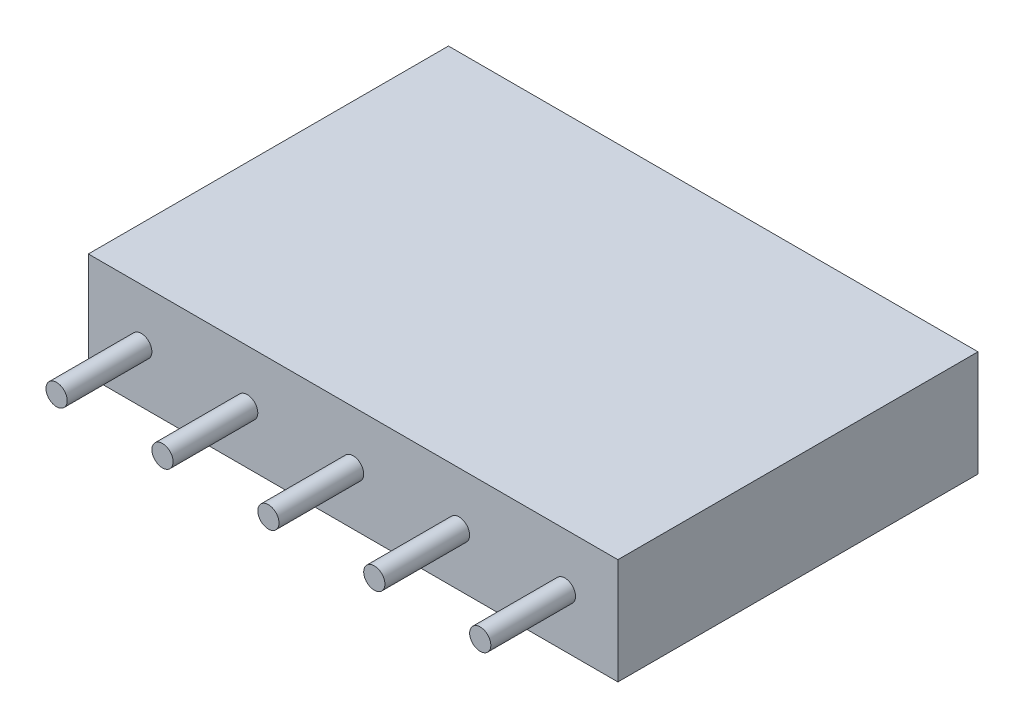
ISO-10303-21;
HEADER;
FILE_DESCRIPTION(('STEP AP214'),'2;1');
FILE_NAME('part.step','',(''),(''),'','','');
FILE_SCHEMA(('AUTOMOTIVE_DESIGN { 1 0 10303 214 1 1 1 1 }'));
ENDSEC;
DATA;
#1=APPLICATION_CONTEXT('core data for automotive mechanical design processes');
#2=APPLICATION_PROTOCOL_DEFINITION('international standard','automotive_design',2000,#1);
#3=PRODUCT_CONTEXT('',#1,'mechanical');
#4=PRODUCT('Part','Part','',(#3));
#5=PRODUCT_RELATED_PRODUCT_CATEGORY('part','',(#4));
#6=PRODUCT_DEFINITION_FORMATION('','',#4);
#7=PRODUCT_DEFINITION_CONTEXT('part definition',#1,'design');
#8=PRODUCT_DEFINITION('design','',#6,#7);
#9=PRODUCT_DEFINITION_SHAPE('','',#8);
#10=(LENGTH_UNIT() NAMED_UNIT(*) SI_UNIT(.MILLI.,.METRE.));
#11=(NAMED_UNIT(*) PLANE_ANGLE_UNIT() SI_UNIT($,.RADIAN.));
#12=(NAMED_UNIT(*) SI_UNIT($,.STERADIAN.) SOLID_ANGLE_UNIT());
#13=UNCERTAINTY_MEASURE_WITH_UNIT(LENGTH_MEASURE(1.E-05),#10,'distance_accuracy_value','');
#14=(GEOMETRIC_REPRESENTATION_CONTEXT(3) GLOBAL_UNCERTAINTY_ASSIGNED_CONTEXT((#13)) GLOBAL_UNIT_ASSIGNED_CONTEXT((#10,
#11,#12)) REPRESENTATION_CONTEXT('',''));
#15=CARTESIAN_POINT('',(0.,0.,0.));
#16=DIRECTION('',(0.,0.,1.));
#17=DIRECTION('',(1.,0.,0.));
#18=AXIS2_PLACEMENT_3D('',#15,#16,#17);
#19=CARTESIAN_POINT('',(-11.25,1.25,10.5));
#20=DIRECTION('',(0.,0.,1.));
#21=DIRECTION('',(1.,0.,0.));
#22=AXIS2_PLACEMENT_3D('',#19,#20,#21);
#23=PLANE('',#22);
#24=CARTESIAN_POINT('',(-11.25,1.25,10.5));
#25=DIRECTION('',(0.,0.,1.));
#26=DIRECTION('',(1.,0.,0.));
#27=AXIS2_PLACEMENT_3D('',#24,#25,#26);
#28=CIRCLE('',#27,0.25);
#29=CARTESIAN_POINT('',(-11.,1.25,10.5));
#30=VERTEX_POINT('',#29);
#31=EDGE_CURVE('E11',#30,#30,#28,.T.);
#32=ORIENTED_EDGE('',*,*,#31,.T.);
#33=EDGE_LOOP('',(#32));
#34=FACE_BOUND('',#33,.T.);
#35=ADVANCED_FACE('F33',(#34),#23,.T.);
#36=CARTESIAN_POINT('',(-11.25,1.25,10.5));
#37=DIRECTION('',(0.,0.,-1.));
#38=DIRECTION('',(-1.,0.,0.));
#39=AXIS2_PLACEMENT_3D('',#36,#37,#38);
#40=CYLINDRICAL_SURFACE('',#39,0.25);
#41=ORIENTED_EDGE('',*,*,#31,.F.);
#42=EDGE_LOOP('',(#41));
#43=FACE_BOUND('',#42,.T.);
#44=CARTESIAN_POINT('',(-11.25,1.25,8.5));
#45=DIRECTION('',(0.,0.,1.));
#46=DIRECTION('',(1.,0.,0.));
#47=AXIS2_PLACEMENT_3D('',#44,#45,#46);
#48=CIRCLE('',#47,0.25);
#49=CARTESIAN_POINT('',(-11.,1.25,8.5));
#50=VERTEX_POINT('',#49);
#51=EDGE_CURVE('E41',#50,#50,#48,.T.);
#52=ORIENTED_EDGE('',*,*,#51,.T.);
#53=EDGE_LOOP('',(#52));
#54=FACE_BOUND('',#53,.T.);
#55=ADVANCED_FACE('F135',(#43,#54),#40,.T.);
#56=CARTESIAN_POINT('',(-8.75,1.25,10.5));
#57=DIRECTION('',(0.,0.,1.));
#58=DIRECTION('',(1.,0.,0.));
#59=AXIS2_PLACEMENT_3D('',#56,#57,#58);
#60=PLANE('',#59);
#61=CARTESIAN_POINT('',(-8.75,1.25,10.5));
#62=DIRECTION('',(0.,0.,1.));
#63=DIRECTION('',(1.,0.,0.));
#64=AXIS2_PLACEMENT_3D('',#61,#62,#63);
#65=CIRCLE('',#64,0.25);
#66=CARTESIAN_POINT('',(-8.5,1.25,10.5));
#67=VERTEX_POINT('',#66);
#68=EDGE_CURVE('E130',#67,#67,#65,.T.);
#69=ORIENTED_EDGE('',*,*,#68,.T.);
#70=EDGE_LOOP('',(#69));
#71=FACE_BOUND('',#70,.T.);
#72=ADVANCED_FACE('F158',(#71),#60,.T.);
#73=CARTESIAN_POINT('',(-8.75,1.25,10.5));
#74=DIRECTION('',(0.,0.,-1.));
#75=DIRECTION('',(-1.,0.,0.));
#76=AXIS2_PLACEMENT_3D('',#73,#74,#75);
#77=CYLINDRICAL_SURFACE('',#76,0.25);
#78=ORIENTED_EDGE('',*,*,#68,.F.);
#79=EDGE_LOOP('',(#78));
#80=FACE_BOUND('',#79,.T.);
#81=CARTESIAN_POINT('',(-8.75,1.25,8.5));
#82=DIRECTION('',(0.,0.,1.));
#83=DIRECTION('',(1.,0.,0.));
#84=AXIS2_PLACEMENT_3D('',#81,#82,#83);
#85=CIRCLE('',#84,0.25);
#86=CARTESIAN_POINT('',(-8.5,1.25,8.5));
#87=VERTEX_POINT('',#86);
#88=EDGE_CURVE('E127',#87,#87,#85,.T.);
#89=ORIENTED_EDGE('',*,*,#88,.T.);
#90=EDGE_LOOP('',(#89));
#91=FACE_BOUND('',#90,.T.);
#92=ADVANCED_FACE('F164',(#80,#91),#77,.T.);
#93=CARTESIAN_POINT('',(-6.25,1.25,10.5));
#94=DIRECTION('',(0.,0.,1.));
#95=DIRECTION('',(1.,0.,0.));
#96=AXIS2_PLACEMENT_3D('',#93,#94,#95);
#97=PLANE('',#96);
#98=CARTESIAN_POINT('',(-6.25,1.25,10.5));
#99=DIRECTION('',(0.,0.,1.));
#100=DIRECTION('',(1.,0.,0.));
#101=AXIS2_PLACEMENT_3D('',#98,#99,#100);
#102=CIRCLE('',#101,0.25);
#103=CARTESIAN_POINT('',(-6.,1.25,10.5));
#104=VERTEX_POINT('',#103);
#105=EDGE_CURVE('E124',#104,#104,#102,.T.);
#106=ORIENTED_EDGE('',*,*,#105,.T.);
#107=EDGE_LOOP('',(#106));
#108=FACE_BOUND('',#107,.T.);
#109=ADVANCED_FACE('F170',(#108),#97,.T.);
#110=CARTESIAN_POINT('',(-6.25,1.25,10.5));
#111=DIRECTION('',(0.,0.,-1.));
#112=DIRECTION('',(-1.,0.,0.));
#113=AXIS2_PLACEMENT_3D('',#110,#111,#112);
#114=CYLINDRICAL_SURFACE('',#113,0.25);
#115=ORIENTED_EDGE('',*,*,#105,.F.);
#116=EDGE_LOOP('',(#115));
#117=FACE_BOUND('',#116,.T.);
#118=CARTESIAN_POINT('',(-6.25,1.25,8.5));
#119=DIRECTION('',(0.,0.,1.));
#120=DIRECTION('',(1.,0.,0.));
#121=AXIS2_PLACEMENT_3D('',#118,#119,#120);
#122=CIRCLE('',#121,0.25);
#123=CARTESIAN_POINT('',(-6.,1.25,8.5));
#124=VERTEX_POINT('',#123);
#125=EDGE_CURVE('E121',#124,#124,#122,.T.);
#126=ORIENTED_EDGE('',*,*,#125,.T.);
#127=EDGE_LOOP('',(#126));
#128=FACE_BOUND('',#127,.T.);
#129=ADVANCED_FACE('F174',(#117,#128),#114,.T.);
#130=CARTESIAN_POINT('',(0.,0.,8.5));
#131=DIRECTION('',(-1.,0.,0.));
#132=DIRECTION('',(0.,0.,1.));
#133=AXIS2_PLACEMENT_3D('',#130,#131,#132);
#134=PLANE('',#133);
#135=DIRECTION('',(0.,1.,0.));
#136=VECTOR('',#135,1.);
#137=CARTESIAN_POINT('',(0.,0.,0.));
#138=LINE('',#137,#136);
#139=CARTESIAN_POINT('',(0.,0.,0.));
#140=VERTEX_POINT('',#139);
#141=CARTESIAN_POINT('',(0.,2.5,0.));
#142=VERTEX_POINT('',#141);
#143=EDGE_CURVE('E79',#140,#142,#138,.T.);
#144=ORIENTED_EDGE('',*,*,#143,.T.);
#145=DIRECTION('',(0.,0.,-1.));
#146=VECTOR('',#145,1.);
#147=CARTESIAN_POINT('',(0.,2.5,8.5));
#148=LINE('',#147,#146);
#149=CARTESIAN_POINT('',(0.,2.5,8.5));
#150=VERTEX_POINT('',#149);
#151=EDGE_CURVE('E119',#150,#142,#148,.T.);
#152=ORIENTED_EDGE('',*,*,#151,.F.);
#153=DIRECTION('',(0.,1.,0.));
#154=VECTOR('',#153,1.);
#155=CARTESIAN_POINT('',(0.,0.,8.5));
#156=LINE('',#155,#154);
#157=CARTESIAN_POINT('',(0.,0.,8.5));
#158=VERTEX_POINT('',#157);
#159=EDGE_CURVE('E81',#158,#150,#156,.T.);
#160=ORIENTED_EDGE('',*,*,#159,.F.);
#161=DIRECTION('',(0.,0.,-1.));
#162=VECTOR('',#161,1.);
#163=CARTESIAN_POINT('',(0.,0.,8.5));
#164=LINE('',#163,#162);
#165=EDGE_CURVE('E115',#158,#140,#164,.T.);
#166=ORIENTED_EDGE('',*,*,#165,.T.);
#167=EDGE_LOOP('',(#144,#152,#160,#166));
#168=FACE_BOUND('',#167,.T.);
#169=ADVANCED_FACE('F178',(#168),#134,.F.);
#170=CARTESIAN_POINT('',(0.,2.5,8.5));
#171=DIRECTION('',(0.,-1.,0.));
#172=DIRECTION('',(1.,0.,0.));
#173=AXIS2_PLACEMENT_3D('',#170,#171,#172);
#174=PLANE('',#173);
#175=DIRECTION('',(-1.,0.,0.));
#176=VECTOR('',#175,1.);
#177=CARTESIAN_POINT('',(0.,2.5,0.));
#178=LINE('',#177,#176);
#179=CARTESIAN_POINT('',(-12.5,2.5,0.));
#180=VERTEX_POINT('',#179);
#181=EDGE_CURVE('E61',#142,#180,#178,.T.);
#182=ORIENTED_EDGE('',*,*,#181,.T.);
#183=DIRECTION('',(0.,0.,-1.));
#184=VECTOR('',#183,1.);
#185=CARTESIAN_POINT('',(-12.5,2.5,8.5));
#186=LINE('',#185,#184);
#187=CARTESIAN_POINT('',(-12.5,2.5,8.5));
#188=VERTEX_POINT('',#187);
#189=EDGE_CURVE('E90',#188,#180,#186,.T.);
#190=ORIENTED_EDGE('',*,*,#189,.F.);
#191=DIRECTION('',(-1.,0.,0.));
#192=VECTOR('',#191,1.);
#193=CARTESIAN_POINT('',(0.,2.5,8.5));
#194=LINE('',#193,#192);
#195=EDGE_CURVE('E112',#150,#188,#194,.T.);
#196=ORIENTED_EDGE('',*,*,#195,.F.);
#197=ORIENTED_EDGE('',*,*,#151,.T.);
#198=EDGE_LOOP('',(#182,#190,#196,#197));
#199=FACE_BOUND('',#198,.T.);
#200=ADVANCED_FACE('F148',(#199),#174,.F.);
#201=CARTESIAN_POINT('',(0.,0.,8.5));
#202=DIRECTION('',(0.,1.,0.));
#203=DIRECTION('',(0.,0.,1.));
#204=AXIS2_PLACEMENT_3D('',#201,#202,#203);
#205=PLANE('',#204);
#206=DIRECTION('',(1.,0.,0.));
#207=VECTOR('',#206,1.);
#208=CARTESIAN_POINT('',(0.,0.,0.));
#209=LINE('',#208,#207);
#210=CARTESIAN_POINT('',(-12.5,0.,0.));
#211=VERTEX_POINT('',#210);
#212=EDGE_CURVE('E74',#211,#140,#209,.T.);
#213=ORIENTED_EDGE('',*,*,#212,.T.);
#214=ORIENTED_EDGE('',*,*,#165,.F.);
#215=DIRECTION('',(1.,0.,0.));
#216=VECTOR('',#215,1.);
#217=CARTESIAN_POINT('',(0.,0.,8.5));
#218=LINE('',#217,#216);
#219=CARTESIAN_POINT('',(-12.5,0.,8.5));
#220=VERTEX_POINT('',#219);
#221=EDGE_CURVE('E49',#220,#158,#218,.T.);
#222=ORIENTED_EDGE('',*,*,#221,.F.);
#223=DIRECTION('',(0.,0.,-1.));
#224=VECTOR('',#223,1.);
#225=CARTESIAN_POINT('',(-12.5,0.,8.5));
#226=LINE('',#225,#224);
#227=EDGE_CURVE('E88',#220,#211,#226,.T.);
#228=ORIENTED_EDGE('',*,*,#227,.T.);
#229=EDGE_LOOP('',(#213,#214,#222,#228));
#230=FACE_BOUND('',#229,.T.);
#231=ADVANCED_FACE('F94',(#230),#205,.F.);
#232=CARTESIAN_POINT('',(0.,0.,8.5));
#233=DIRECTION('',(0.,0.,1.));
#234=DIRECTION('',(1.,0.,0.));
#235=AXIS2_PLACEMENT_3D('',#232,#233,#234);
#236=PLANE('',#235);
#237=CARTESIAN_POINT('',(-3.75,1.25,8.5));
#238=DIRECTION('',(0.,0.,1.));
#239=DIRECTION('',(1.,0.,0.));
#240=AXIS2_PLACEMENT_3D('',#237,#238,#239);
#241=CIRCLE('',#240,0.25);
#242=CARTESIAN_POINT('',(-3.5,1.25,8.5));
#243=VERTEX_POINT('',#242);
#244=EDGE_CURVE('E421',#243,#243,#241,.T.);
#245=ORIENTED_EDGE('',*,*,#244,.F.);
#246=EDGE_LOOP('',(#245));
#247=FACE_BOUND('',#246,.T.);
#248=CARTESIAN_POINT('',(-1.25,1.25,8.5));
#249=DIRECTION('',(0.,0.,1.));
#250=DIRECTION('',(1.,0.,0.));
#251=AXIS2_PLACEMENT_3D('',#248,#249,#250);
#252=CIRCLE('',#251,0.25);
#253=CARTESIAN_POINT('',(-1.,1.25,8.5));
#254=VERTEX_POINT('',#253);
#255=EDGE_CURVE('E103',#254,#254,#252,.T.);
#256=ORIENTED_EDGE('',*,*,#255,.F.);
#257=EDGE_LOOP('',(#256));
#258=FACE_BOUND('',#257,.T.);
#259=ORIENTED_EDGE('',*,*,#159,.T.);
#260=ORIENTED_EDGE('',*,*,#195,.T.);
#261=DIRECTION('',(0.,-1.,0.));
#262=VECTOR('',#261,1.);
#263=CARTESIAN_POINT('',(-12.5,0.,8.5));
#264=LINE('',#263,#262);
#265=EDGE_CURVE('E91',#188,#220,#264,.T.);
#266=ORIENTED_EDGE('',*,*,#265,.T.);
#267=ORIENTED_EDGE('',*,*,#221,.T.);
#268=EDGE_LOOP('',(#259,#260,#266,#267));
#269=FACE_BOUND('',#268,.T.);
#270=ORIENTED_EDGE('',*,*,#125,.F.);
#271=EDGE_LOOP('',(#270));
#272=FACE_BOUND('',#271,.T.);
#273=ORIENTED_EDGE('',*,*,#88,.F.);
#274=EDGE_LOOP('',(#273));
#275=FACE_BOUND('',#274,.T.);
#276=ORIENTED_EDGE('',*,*,#51,.F.);
#277=EDGE_LOOP('',(#276));
#278=FACE_BOUND('',#277,.T.);
#279=ADVANCED_FACE('F137',(#247,#258,#269,#272,#275,#278),#236,.T.);
#280=CARTESIAN_POINT('',(0.,0.,0.));
#281=DIRECTION('',(0.,0.,1.));
#282=DIRECTION('',(1.,0.,0.));
#283=AXIS2_PLACEMENT_3D('',#280,#281,#282);
#284=PLANE('',#283);
#285=CARTESIAN_POINT('',(-3.75,1.25,0.));
#286=DIRECTION('',(0.,0.,-1.));
#287=DIRECTION('',(-1.,0.,0.));
#288=AXIS2_PLACEMENT_3D('',#285,#286,#287);
#289=CIRCLE('',#288,0.25);
#290=CARTESIAN_POINT('',(-4.,1.25,0.));
#291=VERTEX_POINT('',#290);
#292=EDGE_CURVE('E422',#291,#291,#289,.T.);
#293=ORIENTED_EDGE('',*,*,#292,.F.);
#294=EDGE_LOOP('',(#293));
#295=FACE_BOUND('',#294,.T.);
#296=CARTESIAN_POINT('',(-6.25,1.25,0.));
#297=DIRECTION('',(0.,0.,-1.));
#298=DIRECTION('',(-1.,0.,0.));
#299=AXIS2_PLACEMENT_3D('',#296,#297,#298);
#300=CIRCLE('',#299,0.25);
#301=CARTESIAN_POINT('',(-6.5,1.25,0.));
#302=VERTEX_POINT('',#301);
#303=EDGE_CURVE('E432',#302,#302,#300,.T.);
#304=ORIENTED_EDGE('',*,*,#303,.F.);
#305=EDGE_LOOP('',(#304));
#306=FACE_BOUND('',#305,.T.);
#307=CARTESIAN_POINT('',(-8.75,1.25,0.));
#308=DIRECTION('',(0.,0.,-1.));
#309=DIRECTION('',(-1.,0.,0.));
#310=AXIS2_PLACEMENT_3D('',#307,#308,#309);
#311=CIRCLE('',#310,0.25);
#312=CARTESIAN_POINT('',(-9.,1.25,0.));
#313=VERTEX_POINT('',#312);
#314=EDGE_CURVE('E438',#313,#313,#311,.T.);
#315=ORIENTED_EDGE('',*,*,#314,.F.);
#316=EDGE_LOOP('',(#315));
#317=FACE_BOUND('',#316,.T.);
#318=CARTESIAN_POINT('',(-11.25,1.25,0.));
#319=DIRECTION('',(0.,0.,-1.));
#320=DIRECTION('',(-1.,0.,0.));
#321=AXIS2_PLACEMENT_3D('',#318,#319,#320);
#322=CIRCLE('',#321,0.25);
#323=CARTESIAN_POINT('',(-11.5,1.25,0.));
#324=VERTEX_POINT('',#323);
#325=EDGE_CURVE('E444',#324,#324,#322,.T.);
#326=ORIENTED_EDGE('',*,*,#325,.F.);
#327=EDGE_LOOP('',(#326));
#328=FACE_BOUND('',#327,.T.);
#329=CARTESIAN_POINT('',(-1.25,1.25,0.));
#330=DIRECTION('',(0.,0.,-1.));
#331=DIRECTION('',(-1.,0.,0.));
#332=AXIS2_PLACEMENT_3D('',#329,#330,#331);
#333=CIRCLE('',#332,0.25);
#334=CARTESIAN_POINT('',(-1.5,1.25,0.));
#335=VERTEX_POINT('',#334);
#336=EDGE_CURVE('E96',#335,#335,#333,.T.);
#337=ORIENTED_EDGE('',*,*,#336,.F.);
#338=EDGE_LOOP('',(#337));
#339=FACE_BOUND('',#338,.T.);
#340=ORIENTED_EDGE('',*,*,#143,.F.);
#341=ORIENTED_EDGE('',*,*,#212,.F.);
#342=DIRECTION('',(0.,-1.,0.));
#343=VECTOR('',#342,1.);
#344=CARTESIAN_POINT('',(-12.5,0.,0.));
#345=LINE('',#344,#343);
#346=EDGE_CURVE('E77',#180,#211,#345,.T.);
#347=ORIENTED_EDGE('',*,*,#346,.F.);
#348=ORIENTED_EDGE('',*,*,#181,.F.);
#349=EDGE_LOOP('',(#340,#341,#347,#348));
#350=FACE_BOUND('',#349,.T.);
#351=ADVANCED_FACE('F76',(#295,#306,#317,#328,#339,#350),#284,.F.);
#352=CARTESIAN_POINT('',(-1.25,1.25,10.5));
#353=DIRECTION('',(0.,0.,-1.));
#354=DIRECTION('',(-1.,0.,0.));
#355=AXIS2_PLACEMENT_3D('',#352,#353,#354);
#356=CYLINDRICAL_SURFACE('',#355,0.25);
#357=CARTESIAN_POINT('',(-1.25,1.25,10.5));
#358=DIRECTION('',(0.,0.,1.));
#359=DIRECTION('',(1.,0.,0.));
#360=AXIS2_PLACEMENT_3D('',#357,#358,#359);
#361=CIRCLE('',#360,0.25);
#362=CARTESIAN_POINT('',(-1.,1.25,10.5));
#363=VERTEX_POINT('',#362);
#364=EDGE_CURVE('E106',#363,#363,#361,.T.);
#365=ORIENTED_EDGE('',*,*,#364,.F.);
#366=EDGE_LOOP('',(#365));
#367=FACE_BOUND('',#366,.T.);
#368=ORIENTED_EDGE('',*,*,#255,.T.);
#369=EDGE_LOOP('',(#368));
#370=FACE_BOUND('',#369,.T.);
#371=ADVANCED_FACE('F145',(#367,#370),#356,.T.);
#372=CARTESIAN_POINT('',(-1.25,1.25,10.5));
#373=DIRECTION('',(0.,0.,1.));
#374=DIRECTION('',(1.,0.,0.));
#375=AXIS2_PLACEMENT_3D('',#372,#373,#374);
#376=PLANE('',#375);
#377=ORIENTED_EDGE('',*,*,#364,.T.);
#378=EDGE_LOOP('',(#377));
#379=FACE_BOUND('',#378,.T.);
#380=ADVANCED_FACE('F339',(#379),#376,.T.);
#381=CARTESIAN_POINT('',(-1.25,1.25,4.));
#382=DIRECTION('',(0.,0.,-1.));
#383=DIRECTION('',(-1.,0.,0.));
#384=AXIS2_PLACEMENT_3D('',#381,#382,#383);
#385=CYLINDRICAL_SURFACE('',#384,0.25);
#386=CARTESIAN_POINT('',(-1.25,1.25,4.));
#387=DIRECTION('',(0.,0.,-1.));
#388=DIRECTION('',(-1.,0.,0.));
#389=AXIS2_PLACEMENT_3D('',#386,#387,#388);
#390=CIRCLE('',#389,0.25);
#391=CARTESIAN_POINT('',(-1.5,1.25,4.));
#392=VERTEX_POINT('',#391);
#393=EDGE_CURVE('E100',#392,#392,#390,.T.);
#394=ORIENTED_EDGE('',*,*,#393,.F.);
#395=EDGE_LOOP('',(#394));
#396=FACE_BOUND('',#395,.T.);
#397=ORIENTED_EDGE('',*,*,#336,.T.);
#398=EDGE_LOOP('',(#397));
#399=FACE_BOUND('',#398,.T.);
#400=ADVANCED_FACE('F335',(#396,#399),#385,.F.);
#401=CARTESIAN_POINT('',(-1.25,1.25,4.));
#402=DIRECTION('',(0.,0.,-1.));
#403=DIRECTION('',(-1.,0.,0.));
#404=AXIS2_PLACEMENT_3D('',#401,#402,#403);
#405=PLANE('',#404);
#406=ORIENTED_EDGE('',*,*,#393,.T.);
#407=EDGE_LOOP('',(#406));
#408=FACE_BOUND('',#407,.T.);
#409=ADVANCED_FACE('F226',(#408),#405,.T.);
#410=CARTESIAN_POINT('',(-12.5,0.,8.5));
#411=DIRECTION('',(1.,0.,0.));
#412=DIRECTION('',(0.,0.,-1.));
#413=AXIS2_PLACEMENT_3D('',#410,#411,#412);
#414=PLANE('',#413);
#415=ORIENTED_EDGE('',*,*,#346,.T.);
#416=ORIENTED_EDGE('',*,*,#227,.F.);
#417=ORIENTED_EDGE('',*,*,#265,.F.);
#418=ORIENTED_EDGE('',*,*,#189,.T.);
#419=EDGE_LOOP('',(#415,#416,#417,#418));
#420=FACE_BOUND('',#419,.T.);
#421=ADVANCED_FACE('F86',(#420),#414,.F.);
#422=CARTESIAN_POINT('',(-3.75,1.25,10.5));
#423=DIRECTION('',(0.,0.,-1.));
#424=DIRECTION('',(-1.,0.,0.));
#425=AXIS2_PLACEMENT_3D('',#422,#423,#424);
#426=CYLINDRICAL_SURFACE('',#425,0.25);
#427=CARTESIAN_POINT('',(-3.75,1.25,10.5));
#428=DIRECTION('',(0.,0.,1.));
#429=DIRECTION('',(1.,0.,0.));
#430=AXIS2_PLACEMENT_3D('',#427,#428,#429);
#431=CIRCLE('',#430,0.25);
#432=CARTESIAN_POINT('',(-3.5,1.25,10.5));
#433=VERTEX_POINT('',#432);
#434=EDGE_CURVE('E92',#433,#433,#431,.T.);
#435=ORIENTED_EDGE('',*,*,#434,.F.);
#436=EDGE_LOOP('',(#435));
#437=FACE_BOUND('',#436,.T.);
#438=ORIENTED_EDGE('',*,*,#244,.T.);
#439=EDGE_LOOP('',(#438));
#440=FACE_BOUND('',#439,.T.);
#441=ADVANCED_FACE('F225',(#437,#440),#426,.T.);
#442=CARTESIAN_POINT('',(-3.75,1.25,10.5));
#443=DIRECTION('',(0.,0.,1.));
#444=DIRECTION('',(1.,0.,0.));
#445=AXIS2_PLACEMENT_3D('',#442,#443,#444);
#446=PLANE('',#445);
#447=ORIENTED_EDGE('',*,*,#434,.T.);
#448=EDGE_LOOP('',(#447));
#449=FACE_BOUND('',#448,.T.);
#450=ADVANCED_FACE('F237',(#449),#446,.T.);
#451=CARTESIAN_POINT('',(-11.25,1.25,4.));
#452=DIRECTION('',(0.,0.,-1.));
#453=DIRECTION('',(-1.,0.,0.));
#454=AXIS2_PLACEMENT_3D('',#451,#452,#453);
#455=CYLINDRICAL_SURFACE('',#454,0.25);
#456=CARTESIAN_POINT('',(-11.25,1.25,4.));
#457=DIRECTION('',(0.,0.,-1.));
#458=DIRECTION('',(-1.,0.,0.));
#459=AXIS2_PLACEMENT_3D('',#456,#457,#458);
#460=CIRCLE('',#459,0.25);
#461=CARTESIAN_POINT('',(-11.5,1.25,4.));
#462=VERTEX_POINT('',#461);
#463=EDGE_CURVE('E441',#462,#462,#460,.T.);
#464=ORIENTED_EDGE('',*,*,#463,.F.);
#465=EDGE_LOOP('',(#464));
#466=FACE_BOUND('',#465,.T.);
#467=ORIENTED_EDGE('',*,*,#325,.T.);
#468=EDGE_LOOP('',(#467));
#469=FACE_BOUND('',#468,.T.);
#470=ADVANCED_FACE('F248',(#466,#469),#455,.F.);
#471=CARTESIAN_POINT('',(-11.25,1.25,4.));
#472=DIRECTION('',(0.,0.,-1.));
#473=DIRECTION('',(-1.,0.,0.));
#474=AXIS2_PLACEMENT_3D('',#471,#472,#473);
#475=PLANE('',#474);
#476=ORIENTED_EDGE('',*,*,#463,.T.);
#477=EDGE_LOOP('',(#476));
#478=FACE_BOUND('',#477,.T.);
#479=ADVANCED_FACE('F258',(#478),#475,.T.);
#480=CARTESIAN_POINT('',(-8.75,1.25,4.));
#481=DIRECTION('',(0.,0.,-1.));
#482=DIRECTION('',(-1.,0.,0.));
#483=AXIS2_PLACEMENT_3D('',#480,#481,#482);
#484=CYLINDRICAL_SURFACE('',#483,0.25);
#485=CARTESIAN_POINT('',(-8.75,1.25,4.));
#486=DIRECTION('',(0.,0.,-1.));
#487=DIRECTION('',(-1.,0.,0.));
#488=AXIS2_PLACEMENT_3D('',#485,#486,#487);
#489=CIRCLE('',#488,0.25);
#490=CARTESIAN_POINT('',(-9.,1.25,4.));
#491=VERTEX_POINT('',#490);
#492=EDGE_CURVE('E435',#491,#491,#489,.T.);
#493=ORIENTED_EDGE('',*,*,#492,.F.);
#494=EDGE_LOOP('',(#493));
#495=FACE_BOUND('',#494,.T.);
#496=ORIENTED_EDGE('',*,*,#314,.T.);
#497=EDGE_LOOP('',(#496));
#498=FACE_BOUND('',#497,.T.);
#499=ADVANCED_FACE('F268',(#495,#498),#484,.F.);
#500=CARTESIAN_POINT('',(-8.75,1.25,4.));
#501=DIRECTION('',(0.,0.,-1.));
#502=DIRECTION('',(-1.,0.,0.));
#503=AXIS2_PLACEMENT_3D('',#500,#501,#502);
#504=PLANE('',#503);
#505=ORIENTED_EDGE('',*,*,#492,.T.);
#506=EDGE_LOOP('',(#505));
#507=FACE_BOUND('',#506,.T.);
#508=ADVANCED_FACE('F278',(#507),#504,.T.);
#509=CARTESIAN_POINT('',(-6.25,1.25,4.));
#510=DIRECTION('',(0.,0.,-1.));
#511=DIRECTION('',(-1.,0.,0.));
#512=AXIS2_PLACEMENT_3D('',#509,#510,#511);
#513=CYLINDRICAL_SURFACE('',#512,0.25);
#514=CARTESIAN_POINT('',(-6.25,1.25,4.));
#515=DIRECTION('',(0.,0.,-1.));
#516=DIRECTION('',(-1.,0.,0.));
#517=AXIS2_PLACEMENT_3D('',#514,#515,#516);
#518=CIRCLE('',#517,0.25);
#519=CARTESIAN_POINT('',(-6.5,1.25,4.));
#520=VERTEX_POINT('',#519);
#521=EDGE_CURVE('E427',#520,#520,#518,.T.);
#522=ORIENTED_EDGE('',*,*,#521,.F.);
#523=EDGE_LOOP('',(#522));
#524=FACE_BOUND('',#523,.T.);
#525=ORIENTED_EDGE('',*,*,#303,.T.);
#526=EDGE_LOOP('',(#525));
#527=FACE_BOUND('',#526,.T.);
#528=ADVANCED_FACE('F288',(#524,#527),#513,.F.);
#529=CARTESIAN_POINT('',(-6.25,1.25,4.));
#530=DIRECTION('',(0.,0.,-1.));
#531=DIRECTION('',(-1.,0.,0.));
#532=AXIS2_PLACEMENT_3D('',#529,#530,#531);
#533=PLANE('',#532);
#534=ORIENTED_EDGE('',*,*,#521,.T.);
#535=EDGE_LOOP('',(#534));
#536=FACE_BOUND('',#535,.T.);
#537=ADVANCED_FACE('F298',(#536),#533,.T.);
#538=CARTESIAN_POINT('',(-3.75,1.25,4.));
#539=DIRECTION('',(0.,0.,-1.));
#540=DIRECTION('',(-1.,0.,0.));
#541=AXIS2_PLACEMENT_3D('',#538,#539,#540);
#542=CYLINDRICAL_SURFACE('',#541,0.25);
#543=CARTESIAN_POINT('',(-3.75,1.25,4.));
#544=DIRECTION('',(0.,0.,-1.));
#545=DIRECTION('',(-1.,0.,0.));
#546=AXIS2_PLACEMENT_3D('',#543,#544,#545);
#547=CIRCLE('',#546,0.25);
#548=CARTESIAN_POINT('',(-4.,1.25,4.));
#549=VERTEX_POINT('',#548);
#550=EDGE_CURVE('E420',#549,#549,#547,.T.);
#551=ORIENTED_EDGE('',*,*,#550,.F.);
#552=EDGE_LOOP('',(#551));
#553=FACE_BOUND('',#552,.T.);
#554=ORIENTED_EDGE('',*,*,#292,.T.);
#555=EDGE_LOOP('',(#554));
#556=FACE_BOUND('',#555,.T.);
#557=ADVANCED_FACE('F308',(#553,#556),#542,.F.);
#558=CARTESIAN_POINT('',(-3.75,1.25,4.));
#559=DIRECTION('',(0.,0.,-1.));
#560=DIRECTION('',(-1.,0.,0.));
#561=AXIS2_PLACEMENT_3D('',#558,#559,#560);
#562=PLANE('',#561);
#563=ORIENTED_EDGE('',*,*,#550,.T.);
#564=EDGE_LOOP('',(#563));
#565=FACE_BOUND('',#564,.T.);
#566=ADVANCED_FACE('F318',(#565),#562,.T.);
#567=CLOSED_SHELL('',(#35,#55,#72,#92,#109,#129,#169,#200,#231,#279,#351,#371,#380,#400,#409,
#421,#441,#450,#470,#479,#499,#508,#528,#537,#557,#566));
#568=MANIFOLD_SOLID_BREP('B2',#567);
#569=ADVANCED_BREP_SHAPE_REPRESENTATION('',(#18,#568),#14);
#570=SHAPE_DEFINITION_REPRESENTATION(#9,#569);
ENDSEC;
END-ISO-10303-21;
